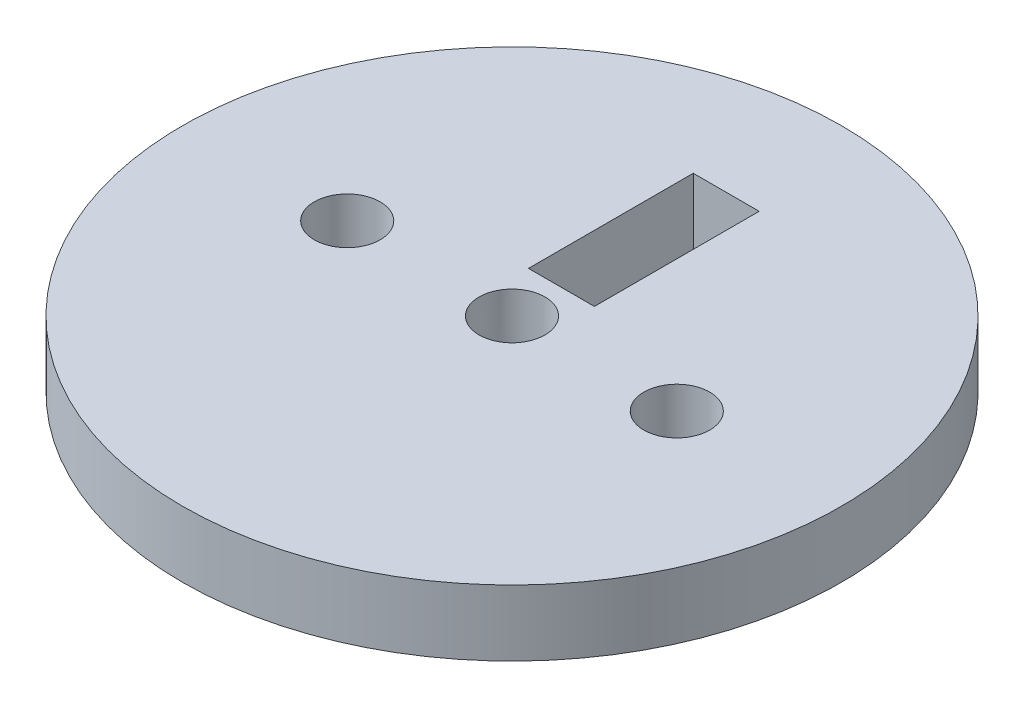
ISO-10303-21;
HEADER;
FILE_DESCRIPTION(('STEP AP214'),'2;1');
FILE_NAME('part.step','',(''),(''),'','','');
FILE_SCHEMA(('AUTOMOTIVE_DESIGN { 1 0 10303 214 1 1 1 1 }'));
ENDSEC;
DATA;
#1=APPLICATION_CONTEXT('core data for automotive mechanical design processes');
#2=APPLICATION_PROTOCOL_DEFINITION('international standard','automotive_design',2000,#1);
#3=PRODUCT_CONTEXT('',#1,'mechanical');
#4=PRODUCT('Part','Part','',(#3));
#5=PRODUCT_RELATED_PRODUCT_CATEGORY('part','',(#4));
#6=PRODUCT_DEFINITION_FORMATION('','',#4);
#7=PRODUCT_DEFINITION_CONTEXT('part definition',#1,'design');
#8=PRODUCT_DEFINITION('design','',#6,#7);
#9=PRODUCT_DEFINITION_SHAPE('','',#8);
#10=(LENGTH_UNIT() NAMED_UNIT(*) SI_UNIT(.MILLI.,.METRE.));
#11=(NAMED_UNIT(*) PLANE_ANGLE_UNIT() SI_UNIT($,.RADIAN.));
#12=(NAMED_UNIT(*) SI_UNIT($,.STERADIAN.) SOLID_ANGLE_UNIT());
#13=UNCERTAINTY_MEASURE_WITH_UNIT(LENGTH_MEASURE(1.E-05),#10,'distance_accuracy_value','');
#14=(GEOMETRIC_REPRESENTATION_CONTEXT(3) GLOBAL_UNCERTAINTY_ASSIGNED_CONTEXT((#13)) GLOBAL_UNIT_ASSIGNED_CONTEXT((#10,
#11,#12)) REPRESENTATION_CONTEXT('',''));
#15=CARTESIAN_POINT('',(0.,0.,0.));
#16=DIRECTION('',(0.,0.,1.));
#17=DIRECTION('',(1.,0.,0.));
#18=AXIS2_PLACEMENT_3D('',#15,#16,#17);
#19=CARTESIAN_POINT('',(1.,0.,-1.5));
#20=DIRECTION('',(0.,0.,1.));
#21=DIRECTION('',(1.,0.,0.));
#22=AXIS2_PLACEMENT_3D('',#19,#20,#21);
#23=PLANE('',#22);
#24=DIRECTION('',(1.,0.,0.));
#25=VECTOR('',#24,1.);
#26=CARTESIAN_POINT('',(1.,0.2,-1.5));
#27=LINE('',#26,#25);
#28=CARTESIAN_POINT('',(-1.,0.2,-1.5));
#29=VERTEX_POINT('',#28);
#30=CARTESIAN_POINT('',(1.,0.2,-1.5));
#31=VERTEX_POINT('',#30);
#32=EDGE_CURVE('E138',#29,#31,#27,.T.);
#33=ORIENTED_EDGE('',*,*,#32,.F.);
#34=DIRECTION('',(0.,1.,0.));
#35=VECTOR('',#34,1.);
#36=CARTESIAN_POINT('',(-1.,0.,-1.5));
#37=LINE('',#36,#35);
#38=CARTESIAN_POINT('',(-1.,2.,-1.5));
#39=VERTEX_POINT('',#38);
#40=EDGE_CURVE('E56',#29,#39,#37,.T.);
#41=ORIENTED_EDGE('',*,*,#40,.T.);
#42=DIRECTION('',(1.,0.,0.));
#43=VECTOR('',#42,1.);
#44=CARTESIAN_POINT('',(1.,2.,-1.5));
#45=LINE('',#44,#43);
#46=CARTESIAN_POINT('',(1.,2.,-1.5));
#47=VERTEX_POINT('',#46);
#48=EDGE_CURVE('E119',#39,#47,#45,.T.);
#49=ORIENTED_EDGE('',*,*,#48,.T.);
#50=DIRECTION('',(0.,1.,0.));
#51=VECTOR('',#50,1.);
#52=CARTESIAN_POINT('',(1.,0.,-1.5));
#53=LINE('',#52,#51);
#54=EDGE_CURVE('E130',#31,#47,#53,.T.);
#55=ORIENTED_EDGE('',*,*,#54,.F.);
#56=EDGE_LOOP('',(#33,#41,#49,#55));
#57=FACE_BOUND('',#56,.T.);
#58=ADVANCED_FACE('F34',(#57),#23,.F.);
#59=CARTESIAN_POINT('',(0.,0.,0.));
#60=DIRECTION('',(0.,1.,0.));
#61=DIRECTION('',(0.,0.,1.));
#62=AXIS2_PLACEMENT_3D('',#59,#60,#61);
#63=CYLINDRICAL_SURFACE('',#62,1.);
#64=CARTESIAN_POINT('',(0.,2.,0.));
#65=DIRECTION('',(0.,1.,0.));
#66=DIRECTION('',(0.,0.,1.));
#67=AXIS2_PLACEMENT_3D('',#64,#65,#66);
#68=CIRCLE('',#67,1.);
#69=CARTESIAN_POINT('',(0.,2.,1.));
#70=VERTEX_POINT('',#69);
#71=EDGE_CURVE('E120',#70,#70,#68,.T.);
#72=ORIENTED_EDGE('',*,*,#71,.T.);
#73=EDGE_LOOP('',(#72));
#74=FACE_BOUND('',#73,.T.);
#75=CARTESIAN_POINT('',(0.,0.2,0.));
#76=DIRECTION('',(0.,-1.,0.));
#77=DIRECTION('',(0.,0.,-1.));
#78=AXIS2_PLACEMENT_3D('',#75,#76,#77);
#79=CIRCLE('',#78,1.);
#80=CARTESIAN_POINT('',(0.,0.2,-1.));
#81=VERTEX_POINT('',#80);
#82=EDGE_CURVE('E136',#81,#81,#79,.F.);
#83=ORIENTED_EDGE('',*,*,#82,.F.);
#84=EDGE_LOOP('',(#83));
#85=FACE_BOUND('',#84,.T.);
#86=ADVANCED_FACE('F163',(#74,#85),#63,.F.);
#87=CARTESIAN_POINT('',(0.,2.,0.));
#88=DIRECTION('',(0.,-1.,0.));
#89=DIRECTION('',(0.,0.,-1.));
#90=AXIS2_PLACEMENT_3D('',#87,#88,#89);
#91=CYLINDRICAL_SURFACE('',#90,10.);
#92=CARTESIAN_POINT('',(0.,2.,0.));
#93=DIRECTION('',(0.,1.,0.));
#94=DIRECTION('',(0.,0.,1.));
#95=AXIS2_PLACEMENT_3D('',#92,#93,#94);
#96=CIRCLE('',#95,10.);
#97=CARTESIAN_POINT('',(0.,2.,10.));
#98=VERTEX_POINT('',#97);
#99=EDGE_CURVE('E42',#98,#98,#96,.T.);
#100=ORIENTED_EDGE('',*,*,#99,.F.);
#101=EDGE_LOOP('',(#100));
#102=FACE_BOUND('',#101,.T.);
#103=CARTESIAN_POINT('',(0.,0.,0.));
#104=DIRECTION('',(0.,1.,0.));
#105=DIRECTION('',(0.,0.,1.));
#106=AXIS2_PLACEMENT_3D('',#103,#104,#105);
#107=CIRCLE('',#106,10.);
#108=CARTESIAN_POINT('',(0.,0.,10.));
#109=VERTEX_POINT('',#108);
#110=EDGE_CURVE('E128',#109,#109,#107,.T.);
#111=ORIENTED_EDGE('',*,*,#110,.T.);
#112=EDGE_LOOP('',(#111));
#113=FACE_BOUND('',#112,.T.);
#114=ADVANCED_FACE('F36',(#102,#113),#91,.T.);
#115=CARTESIAN_POINT('',(0.,2.,0.));
#116=DIRECTION('',(0.,1.,0.));
#117=DIRECTION('',(0.,0.,1.));
#118=AXIS2_PLACEMENT_3D('',#115,#116,#117);
#119=PLANE('',#118);
#120=CARTESIAN_POINT('',(-5.,2.,0.));
#121=DIRECTION('',(0.,1.,0.));
#122=DIRECTION('',(0.,0.,-1.));
#123=AXIS2_PLACEMENT_3D('',#120,#121,#122);
#124=CIRCLE('',#123,1.);
#125=CARTESIAN_POINT('',(-5.,2.,-1.));
#126=VERTEX_POINT('',#125);
#127=EDGE_CURVE('E149',#126,#126,#124,.T.);
#128=ORIENTED_EDGE('',*,*,#127,.F.);
#129=EDGE_LOOP('',(#128));
#130=FACE_BOUND('',#129,.T.);
#131=CARTESIAN_POINT('',(5.,2.,0.));
#132=DIRECTION('',(0.,1.,0.));
#133=DIRECTION('',(0.,0.,1.));
#134=AXIS2_PLACEMENT_3D('',#131,#132,#133);
#135=CIRCLE('',#134,1.);
#136=CARTESIAN_POINT('',(5.,2.,1.));
#137=VERTEX_POINT('',#136);
#138=EDGE_CURVE('E153',#137,#137,#135,.T.);
#139=ORIENTED_EDGE('',*,*,#138,.F.);
#140=EDGE_LOOP('',(#139));
#141=FACE_BOUND('',#140,.T.);
#142=ORIENTED_EDGE('',*,*,#71,.F.);
#143=EDGE_LOOP('',(#142));
#144=FACE_BOUND('',#143,.T.);
#145=DIRECTION('',(0.,0.,1.));
#146=VECTOR('',#145,1.);
#147=CARTESIAN_POINT('',(-1.,2.,-1.5));
#148=LINE('',#147,#146);
#149=CARTESIAN_POINT('',(-1.,2.,-6.5));
#150=VERTEX_POINT('',#149);
#151=EDGE_CURVE('E117',#150,#39,#148,.T.);
#152=ORIENTED_EDGE('',*,*,#151,.F.);
#153=DIRECTION('',(-1.,0.,0.));
#154=VECTOR('',#153,1.);
#155=CARTESIAN_POINT('',(1.,2.,-6.5));
#156=LINE('',#155,#154);
#157=CARTESIAN_POINT('',(1.,2.,-6.5));
#158=VERTEX_POINT('',#157);
#159=EDGE_CURVE('E113',#158,#150,#156,.T.);
#160=ORIENTED_EDGE('',*,*,#159,.F.);
#161=DIRECTION('',(0.,0.,-1.));
#162=VECTOR('',#161,1.);
#163=CARTESIAN_POINT('',(1.,2.,-1.5));
#164=LINE('',#163,#162);
#165=EDGE_CURVE('E122',#47,#158,#164,.T.);
#166=ORIENTED_EDGE('',*,*,#165,.F.);
#167=ORIENTED_EDGE('',*,*,#48,.F.);
#168=EDGE_LOOP('',(#152,#160,#166,#167));
#169=FACE_BOUND('',#168,.T.);
#170=ORIENTED_EDGE('',*,*,#99,.T.);
#171=EDGE_LOOP('',(#170));
#172=FACE_BOUND('',#171,.T.);
#173=ADVANCED_FACE('F166',(#130,#141,#144,#169,#172),#119,.T.);
#174=CARTESIAN_POINT('',(0.,0.,0.));
#175=DIRECTION('',(0.,1.,0.));
#176=DIRECTION('',(0.,0.,1.));
#177=AXIS2_PLACEMENT_3D('',#174,#175,#176);
#178=PLANE('',#177);
#179=CARTESIAN_POINT('',(-5.,0.,0.));
#180=DIRECTION('',(0.,1.,0.));
#181=DIRECTION('',(0.,0.,-1.));
#182=AXIS2_PLACEMENT_3D('',#179,#180,#181);
#183=CIRCLE('',#182,1.);
#184=CARTESIAN_POINT('',(-5.,0.,-1.));
#185=VERTEX_POINT('',#184);
#186=EDGE_CURVE('E150',#185,#185,#183,.T.);
#187=ORIENTED_EDGE('',*,*,#186,.T.);
#188=EDGE_LOOP('',(#187));
#189=FACE_BOUND('',#188,.T.);
#190=CARTESIAN_POINT('',(5.,0.,0.));
#191=DIRECTION('',(0.,1.,0.));
#192=DIRECTION('',(0.,0.,1.));
#193=AXIS2_PLACEMENT_3D('',#190,#191,#192);
#194=CIRCLE('',#193,1.);
#195=CARTESIAN_POINT('',(5.,0.,1.));
#196=VERTEX_POINT('',#195);
#197=EDGE_CURVE('E156',#196,#196,#194,.T.);
#198=ORIENTED_EDGE('',*,*,#197,.T.);
#199=EDGE_LOOP('',(#198));
#200=FACE_BOUND('',#199,.T.);
#201=DIRECTION('',(0.,0.,1.));
#202=VECTOR('',#201,1.);
#203=CARTESIAN_POINT('',(-1.,0.,-1.5));
#204=LINE('',#203,#202);
#205=CARTESIAN_POINT('',(-1.,0.,-6.5));
#206=VERTEX_POINT('',#205);
#207=CARTESIAN_POINT('',(-1.,0.,-3.03973683071413));
#208=VERTEX_POINT('',#207);
#209=EDGE_CURVE('E104',#206,#208,#204,.T.);
#210=ORIENTED_EDGE('',*,*,#209,.T.);
#211=CARTESIAN_POINT('',(0.,0.,0.));
#212=DIRECTION('',(0.,-1.,0.));
#213=DIRECTION('',(0.,0.,-1.));
#214=AXIS2_PLACEMENT_3D('',#211,#212,#213);
#215=CIRCLE('',#214,3.2);
#216=CARTESIAN_POINT('',(1.,0.,-3.03973683071413));
#217=VERTEX_POINT('',#216);
#218=EDGE_CURVE('E90',#217,#208,#215,.T.);
#219=ORIENTED_EDGE('',*,*,#218,.F.);
#220=DIRECTION('',(0.,0.,-1.));
#221=VECTOR('',#220,1.);
#222=CARTESIAN_POINT('',(1.,0.,-1.5));
#223=LINE('',#222,#221);
#224=CARTESIAN_POINT('',(1.,0.,-6.5));
#225=VERTEX_POINT('',#224);
#226=EDGE_CURVE('E101',#217,#225,#223,.T.);
#227=ORIENTED_EDGE('',*,*,#226,.T.);
#228=DIRECTION('',(-1.,0.,0.));
#229=VECTOR('',#228,1.);
#230=CARTESIAN_POINT('',(1.,0.,-6.5));
#231=LINE('',#230,#229);
#232=EDGE_CURVE('E110',#225,#206,#231,.T.);
#233=ORIENTED_EDGE('',*,*,#232,.T.);
#234=EDGE_LOOP('',(#210,#219,#227,#233));
#235=FACE_BOUND('',#234,.T.);
#236=ORIENTED_EDGE('',*,*,#110,.F.);
#237=EDGE_LOOP('',(#236));
#238=FACE_BOUND('',#237,.T.);
#239=ADVANCED_FACE('F98',(#189,#200,#235,#238),#178,.F.);
#240=CARTESIAN_POINT('',(-1.,0.,-1.5));
#241=DIRECTION('',(-1.,0.,0.));
#242=DIRECTION('',(0.,0.,1.));
#243=AXIS2_PLACEMENT_3D('',#240,#241,#242);
#244=PLANE('',#243);
#245=DIRECTION('',(0.,0.,1.));
#246=VECTOR('',#245,1.);
#247=CARTESIAN_POINT('',(-1.,0.2,-1.5));
#248=LINE('',#247,#246);
#249=CARTESIAN_POINT('',(-1.,0.2,-3.03973683071413));
#250=VERTEX_POINT('',#249);
#251=EDGE_CURVE('E49',#250,#29,#248,.T.);
#252=ORIENTED_EDGE('',*,*,#251,.F.);
#253=DIRECTION('',(0.,-1.,0.));
#254=VECTOR('',#253,1.);
#255=CARTESIAN_POINT('',(-1.,0.2,-3.03973683071413));
#256=LINE('',#255,#254);
#257=EDGE_CURVE('E147',#250,#208,#256,.T.);
#258=ORIENTED_EDGE('',*,*,#257,.T.);
#259=ORIENTED_EDGE('',*,*,#209,.F.);
#260=DIRECTION('',(0.,1.,0.));
#261=VECTOR('',#260,1.);
#262=CARTESIAN_POINT('',(-1.,0.,-6.5));
#263=LINE('',#262,#261);
#264=EDGE_CURVE('E126',#206,#150,#263,.T.);
#265=ORIENTED_EDGE('',*,*,#264,.T.);
#266=ORIENTED_EDGE('',*,*,#151,.T.);
#267=ORIENTED_EDGE('',*,*,#40,.F.);
#268=EDGE_LOOP('',(#252,#258,#259,#265,#266,#267));
#269=FACE_BOUND('',#268,.T.);
#270=ADVANCED_FACE('F181',(#269),#244,.F.);
#271=CARTESIAN_POINT('',(1.,0.,-6.5));
#272=DIRECTION('',(0.,0.,-1.));
#273=DIRECTION('',(-1.,0.,0.));
#274=AXIS2_PLACEMENT_3D('',#271,#272,#273);
#275=PLANE('',#274);
#276=ORIENTED_EDGE('',*,*,#159,.T.);
#277=ORIENTED_EDGE('',*,*,#264,.F.);
#278=ORIENTED_EDGE('',*,*,#232,.F.);
#279=DIRECTION('',(0.,1.,0.));
#280=VECTOR('',#279,1.);
#281=CARTESIAN_POINT('',(1.,0.,-6.5));
#282=LINE('',#281,#280);
#283=EDGE_CURVE('E108',#225,#158,#282,.T.);
#284=ORIENTED_EDGE('',*,*,#283,.T.);
#285=EDGE_LOOP('',(#276,#277,#278,#284));
#286=FACE_BOUND('',#285,.T.);
#287=ADVANCED_FACE('F186',(#286),#275,.F.);
#288=CARTESIAN_POINT('',(1.,0.,-1.5));
#289=DIRECTION('',(1.,0.,0.));
#290=DIRECTION('',(0.,0.,-1.));
#291=AXIS2_PLACEMENT_3D('',#288,#289,#290);
#292=PLANE('',#291);
#293=ORIENTED_EDGE('',*,*,#226,.F.);
#294=DIRECTION('',(0.,-1.,0.));
#295=VECTOR('',#294,1.);
#296=CARTESIAN_POINT('',(1.,0.2,-3.03973683071413));
#297=LINE('',#296,#295);
#298=CARTESIAN_POINT('',(1.,0.2,-3.03973683071413));
#299=VERTEX_POINT('',#298);
#300=EDGE_CURVE('E11',#217,#299,#297,.F.);
#301=ORIENTED_EDGE('',*,*,#300,.T.);
#302=DIRECTION('',(0.,0.,-1.));
#303=VECTOR('',#302,1.);
#304=CARTESIAN_POINT('',(1.,0.2,-1.5));
#305=LINE('',#304,#303);
#306=EDGE_CURVE('E141',#31,#299,#305,.T.);
#307=ORIENTED_EDGE('',*,*,#306,.F.);
#308=ORIENTED_EDGE('',*,*,#54,.T.);
#309=ORIENTED_EDGE('',*,*,#165,.T.);
#310=ORIENTED_EDGE('',*,*,#283,.F.);
#311=EDGE_LOOP('',(#293,#301,#307,#308,#309,#310));
#312=FACE_BOUND('',#311,.T.);
#313=ADVANCED_FACE('F106',(#312),#292,.F.);
#314=CARTESIAN_POINT('',(5.,0.,0.));
#315=DIRECTION('',(0.,1.,0.));
#316=DIRECTION('',(0.,0.,1.));
#317=AXIS2_PLACEMENT_3D('',#314,#315,#316);
#318=CYLINDRICAL_SURFACE('',#317,1.);
#319=ORIENTED_EDGE('',*,*,#197,.F.);
#320=EDGE_LOOP('',(#319));
#321=FACE_BOUND('',#320,.T.);
#322=ORIENTED_EDGE('',*,*,#138,.T.);
#323=EDGE_LOOP('',(#322));
#324=FACE_BOUND('',#323,.T.);
#325=ADVANCED_FACE('F199',(#321,#324),#318,.F.);
#326=CARTESIAN_POINT('',(-5.,0.,0.));
#327=DIRECTION('',(0.,1.,0.));
#328=DIRECTION('',(0.,0.,1.));
#329=AXIS2_PLACEMENT_3D('',#326,#327,#328);
#330=CYLINDRICAL_SURFACE('',#329,1.);
#331=ORIENTED_EDGE('',*,*,#186,.F.);
#332=EDGE_LOOP('',(#331));
#333=FACE_BOUND('',#332,.T.);
#334=ORIENTED_EDGE('',*,*,#127,.T.);
#335=EDGE_LOOP('',(#334));
#336=FACE_BOUND('',#335,.T.);
#337=ADVANCED_FACE('F205',(#333,#336),#330,.F.);
#338=CARTESIAN_POINT('',(0.,0.2,0.));
#339=DIRECTION('',(0.,-1.,0.));
#340=DIRECTION('',(0.,0.,-1.));
#341=AXIS2_PLACEMENT_3D('',#338,#339,#340);
#342=CYLINDRICAL_SURFACE('',#341,3.2);
#343=CARTESIAN_POINT('',(0.,0.2,0.));
#344=DIRECTION('',(0.,-1.,0.));
#345=DIRECTION('',(0.,0.,-1.));
#346=AXIS2_PLACEMENT_3D('',#343,#344,#345);
#347=CIRCLE('',#346,3.2);
#348=EDGE_CURVE('E92',#299,#250,#347,.T.);
#349=ORIENTED_EDGE('',*,*,#348,.F.);
#350=ORIENTED_EDGE('',*,*,#300,.F.);
#351=ORIENTED_EDGE('',*,*,#218,.T.);
#352=ORIENTED_EDGE('',*,*,#257,.F.);
#353=EDGE_LOOP('',(#349,#350,#351,#352));
#354=FACE_BOUND('',#353,.T.);
#355=ADVANCED_FACE('F89',(#354),#342,.F.);
#356=CARTESIAN_POINT('',(0.,0.2,0.));
#357=DIRECTION('',(0.,-1.,0.));
#358=DIRECTION('',(0.,0.,-1.));
#359=AXIS2_PLACEMENT_3D('',#356,#357,#358);
#360=PLANE('',#359);
#361=ORIENTED_EDGE('',*,*,#82,.T.);
#362=EDGE_LOOP('',(#361));
#363=FACE_BOUND('',#362,.T.);
#364=ORIENTED_EDGE('',*,*,#251,.T.);
#365=ORIENTED_EDGE('',*,*,#32,.T.);
#366=ORIENTED_EDGE('',*,*,#306,.T.);
#367=ORIENTED_EDGE('',*,*,#348,.T.);
#368=EDGE_LOOP('',(#364,#365,#366,#367));
#369=FACE_BOUND('',#368,.T.);
#370=ADVANCED_FACE('F212',(#363,#369),#360,.T.);
#371=CLOSED_SHELL('',(#58,#86,#114,#173,#239,#270,#287,#313,#325,#337,#355,#370));
#372=MANIFOLD_SOLID_BREP('B2',#371);
#373=ADVANCED_BREP_SHAPE_REPRESENTATION('',(#18,#372),#14);
#374=SHAPE_DEFINITION_REPRESENTATION(#9,#373);
ENDSEC;
END-ISO-10303-21;
